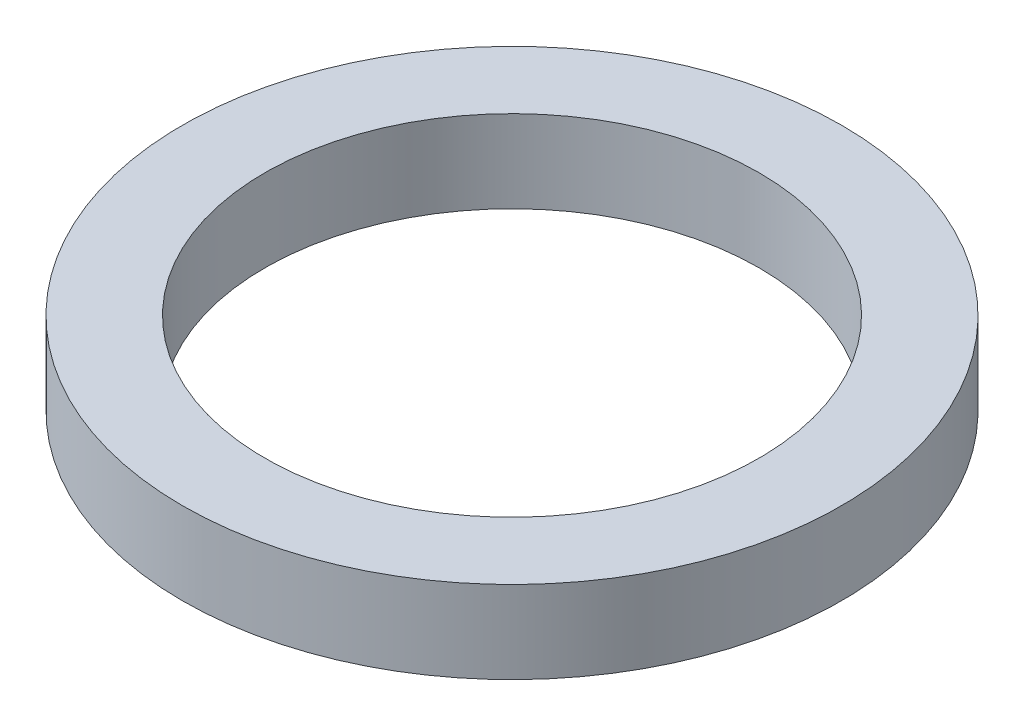
ISO-10303-21;
HEADER;
FILE_DESCRIPTION(('STEP AP214'),'2;1');
FILE_NAME('part.step','',(''),(''),'','','');
FILE_SCHEMA(('AUTOMOTIVE_DESIGN { 1 0 10303 214 1 1 1 1 }'));
ENDSEC;
DATA;
#1=APPLICATION_CONTEXT('core data for automotive mechanical design processes');
#2=APPLICATION_PROTOCOL_DEFINITION('international standard','automotive_design',2000,#1);
#3=PRODUCT_CONTEXT('',#1,'mechanical');
#4=PRODUCT('Part','Part','',(#3));
#5=PRODUCT_RELATED_PRODUCT_CATEGORY('part','',(#4));
#6=PRODUCT_DEFINITION_FORMATION('','',#4);
#7=PRODUCT_DEFINITION_CONTEXT('part definition',#1,'design');
#8=PRODUCT_DEFINITION('design','',#6,#7);
#9=PRODUCT_DEFINITION_SHAPE('','',#8);
#10=(LENGTH_UNIT() NAMED_UNIT(*) SI_UNIT(.MILLI.,.METRE.));
#11=(NAMED_UNIT(*) PLANE_ANGLE_UNIT() SI_UNIT($,.RADIAN.));
#12=(NAMED_UNIT(*) SI_UNIT($,.STERADIAN.) SOLID_ANGLE_UNIT());
#13=UNCERTAINTY_MEASURE_WITH_UNIT(LENGTH_MEASURE(1.E-05),#10,'distance_accuracy_value','');
#14=(GEOMETRIC_REPRESENTATION_CONTEXT(3) GLOBAL_UNCERTAINTY_ASSIGNED_CONTEXT((#13)) GLOBAL_UNIT_ASSIGNED_CONTEXT((#10,
#11,#12)) REPRESENTATION_CONTEXT('',''));
#15=CARTESIAN_POINT('',(0.,0.,0.));
#16=DIRECTION('',(0.,0.,1.));
#17=DIRECTION('',(1.,0.,0.));
#18=AXIS2_PLACEMENT_3D('',#15,#16,#17);
#19=CARTESIAN_POINT('',(0.,-100.,0.));
#20=DIRECTION('',(0.,-1.,0.));
#21=DIRECTION('',(0.,0.,-1.));
#22=AXIS2_PLACEMENT_3D('',#19,#20,#21);
#23=CYLINDRICAL_SURFACE('',#22,300.);
#24=CARTESIAN_POINT('',(0.,-50.,0.));
#25=DIRECTION('',(0.,-1.,0.));
#26=DIRECTION('',(0.,0.,-1.));
#27=AXIS2_PLACEMENT_3D('',#24,#25,#26);
#28=CIRCLE('',#27,300.);
#29=CARTESIAN_POINT('',(0.,-50.,-300.));
#30=VERTEX_POINT('',#29);
#31=EDGE_CURVE('E53',#30,#30,#28,.T.);
#32=ORIENTED_EDGE('',*,*,#31,.T.);
#33=EDGE_LOOP('',(#32));
#34=FACE_BOUND('',#33,.T.);
#35=CARTESIAN_POINT('',(0.,50.,0.));
#36=DIRECTION('',(0.,-1.,0.));
#37=DIRECTION('',(0.,0.,-1.));
#38=AXIS2_PLACEMENT_3D('',#35,#36,#37);
#39=CIRCLE('',#38,300.);
#40=CARTESIAN_POINT('',(0.,50.,-300.));
#41=VERTEX_POINT('',#40);
#42=EDGE_CURVE('E10',#41,#41,#39,.T.);
#43=ORIENTED_EDGE('',*,*,#42,.F.);
#44=EDGE_LOOP('',(#43));
#45=FACE_BOUND('',#44,.T.);
#46=ADVANCED_FACE('F39',(#34,#45),#23,.F.);
#47=CARTESIAN_POINT('',(300.,50.,0.));
#48=DIRECTION('',(0.,1.,0.));
#49=DIRECTION('',(0.,0.,1.));
#50=AXIS2_PLACEMENT_3D('',#47,#48,#49);
#51=PLANE('',#50);
#52=ORIENTED_EDGE('',*,*,#42,.T.);
#53=EDGE_LOOP('',(#52));
#54=FACE_BOUND('',#53,.T.);
#55=CARTESIAN_POINT('',(0.,50.,0.));
#56=DIRECTION('',(0.,-1.,0.));
#57=DIRECTION('',(0.,0.,-1.));
#58=AXIS2_PLACEMENT_3D('',#55,#56,#57);
#59=CIRCLE('',#58,400.);
#60=CARTESIAN_POINT('',(0.,50.,-400.));
#61=VERTEX_POINT('',#60);
#62=EDGE_CURVE('E45',#61,#61,#59,.T.);
#63=ORIENTED_EDGE('',*,*,#62,.F.);
#64=EDGE_LOOP('',(#63));
#65=FACE_BOUND('',#64,.T.);
#66=ADVANCED_FACE('F69',(#54,#65),#51,.T.);
#67=CARTESIAN_POINT('',(0.,-100.,0.));
#68=DIRECTION('',(0.,-1.,0.));
#69=DIRECTION('',(0.,0.,-1.));
#70=AXIS2_PLACEMENT_3D('',#67,#68,#69);
#71=CYLINDRICAL_SURFACE('',#70,400.);
#72=ORIENTED_EDGE('',*,*,#62,.T.);
#73=EDGE_LOOP('',(#72));
#74=FACE_BOUND('',#73,.T.);
#75=CARTESIAN_POINT('',(0.,-50.,0.));
#76=DIRECTION('',(0.,-1.,0.));
#77=DIRECTION('',(0.,0.,-1.));
#78=AXIS2_PLACEMENT_3D('',#75,#76,#77);
#79=CIRCLE('',#78,400.);
#80=CARTESIAN_POINT('',(0.,-50.,-400.));
#81=VERTEX_POINT('',#80);
#82=EDGE_CURVE('E49',#81,#81,#79,.T.);
#83=ORIENTED_EDGE('',*,*,#82,.F.);
#84=EDGE_LOOP('',(#83));
#85=FACE_BOUND('',#84,.T.);
#86=ADVANCED_FACE('F63',(#74,#85),#71,.T.);
#87=CARTESIAN_POINT('',(300.,-50.,0.));
#88=DIRECTION('',(0.,-1.,0.));
#89=DIRECTION('',(0.,0.,-1.));
#90=AXIS2_PLACEMENT_3D('',#87,#88,#89);
#91=PLANE('',#90);
#92=ORIENTED_EDGE('',*,*,#82,.T.);
#93=EDGE_LOOP('',(#92));
#94=FACE_BOUND('',#93,.T.);
#95=ORIENTED_EDGE('',*,*,#31,.F.);
#96=EDGE_LOOP('',(#95));
#97=FACE_BOUND('',#96,.T.);
#98=ADVANCED_FACE('F61',(#94,#97),#91,.T.);
#99=CLOSED_SHELL('',(#46,#66,#86,#98));
#100=MANIFOLD_SOLID_BREP('B2',#99);
#101=ADVANCED_BREP_SHAPE_REPRESENTATION('',(#18,#100),#14);
#102=SHAPE_DEFINITION_REPRESENTATION(#9,#101);
ENDSEC;
END-ISO-10303-21;
